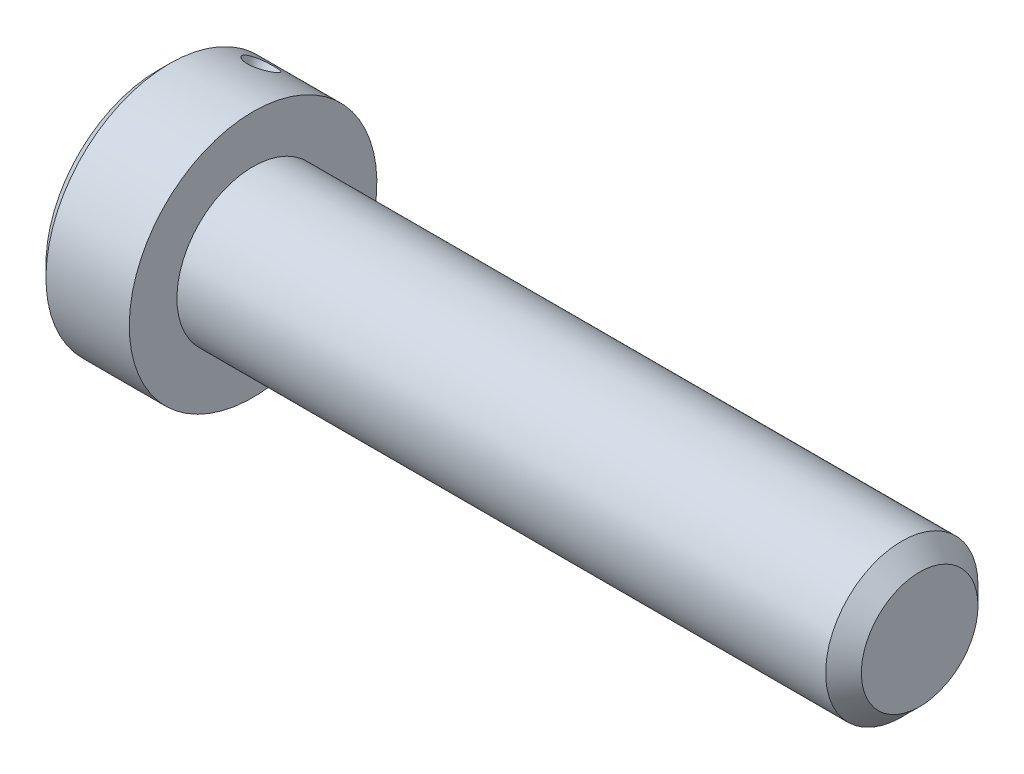
ISO-10303-21;
HEADER;
FILE_DESCRIPTION(('STEP AP214'),'2;1');
FILE_NAME('part.step','',(''),(''),'','','');
FILE_SCHEMA(('AUTOMOTIVE_DESIGN { 1 0 10303 214 1 1 1 1 }'));
ENDSEC;
DATA;
#1=APPLICATION_CONTEXT('core data for automotive mechanical design processes');
#2=APPLICATION_PROTOCOL_DEFINITION('international standard','automotive_design',2000,#1);
#3=PRODUCT_CONTEXT('',#1,'mechanical');
#4=PRODUCT('Part','Part','',(#3));
#5=PRODUCT_RELATED_PRODUCT_CATEGORY('part','',(#4));
#6=PRODUCT_DEFINITION_FORMATION('','',#4);
#7=PRODUCT_DEFINITION_CONTEXT('part definition',#1,'design');
#8=PRODUCT_DEFINITION('design','',#6,#7);
#9=PRODUCT_DEFINITION_SHAPE('','',#8);
#10=(LENGTH_UNIT() NAMED_UNIT(*) SI_UNIT(.MILLI.,.METRE.));
#11=(NAMED_UNIT(*) PLANE_ANGLE_UNIT() SI_UNIT($,.RADIAN.));
#12=(NAMED_UNIT(*) SI_UNIT($,.STERADIAN.) SOLID_ANGLE_UNIT());
#13=UNCERTAINTY_MEASURE_WITH_UNIT(LENGTH_MEASURE(1.E-05),#10,'distance_accuracy_value','');
#14=(GEOMETRIC_REPRESENTATION_CONTEXT(3) GLOBAL_UNCERTAINTY_ASSIGNED_CONTEXT((#13)) GLOBAL_UNIT_ASSIGNED_CONTEXT((#10,
#11,#12)) REPRESENTATION_CONTEXT('',''));
#15=CARTESIAN_POINT('',(0.,0.,0.));
#16=DIRECTION('',(0.,0.,1.));
#17=DIRECTION('',(1.,0.,0.));
#18=AXIS2_PLACEMENT_3D('',#15,#16,#17);
#19=CARTESIAN_POINT('',(-22.5,5.87499999999999,0.));
#20=DIRECTION('',(-1.,0.,0.));
#21=DIRECTION('',(0.,-1.,0.));
#22=AXIS2_PLACEMENT_3D('',#19,#20,#21);
#23=PLANE('',#22);
#24=CARTESIAN_POINT('',(-22.5,0.,0.));
#25=DIRECTION('',(-1.,0.,0.));
#26=DIRECTION('',(0.,-1.,0.));
#27=AXIS2_PLACEMENT_3D('',#24,#25,#26);
#28=CIRCLE('',#27,2.88675134594805);
#29=CARTESIAN_POINT('',(-22.5,-2.886751345948,-2.18358317538581E-13));
#30=VERTEX_POINT('',#29);
#31=CARTESIAN_POINT('',(-22.5,-1.44337567297417,2.49999999999982));
#32=VERTEX_POINT('',#31);
#33=EDGE_CURVE('E139',#30,#32,#28,.T.);
#34=ORIENTED_EDGE('',*,*,#33,.F.);
#35=CARTESIAN_POINT('',(-22.5,-1.44337567297406,-2.5));
#36=VERTEX_POINT('',#35);
#37=EDGE_CURVE('E135',#36,#30,#28,.T.);
#38=ORIENTED_EDGE('',*,*,#37,.F.);
#39=CARTESIAN_POINT('',(-22.5,1.44337567297394,-2.5));
#40=VERTEX_POINT('',#39);
#41=EDGE_CURVE('E103',#40,#36,#28,.T.);
#42=ORIENTED_EDGE('',*,*,#41,.F.);
#43=CARTESIAN_POINT('',(-22.5,2.88675134594809,0.));
#44=VERTEX_POINT('',#43);
#45=EDGE_CURVE('E95',#44,#40,#28,.T.);
#46=ORIENTED_EDGE('',*,*,#45,.F.);
#47=CARTESIAN_POINT('',(-22.5,1.44337567297394,2.5));
#48=VERTEX_POINT('',#47);
#49=EDGE_CURVE('E56',#48,#44,#28,.T.);
#50=ORIENTED_EDGE('',*,*,#49,.F.);
#51=EDGE_CURVE('E63',#32,#48,#28,.T.);
#52=ORIENTED_EDGE('',*,*,#51,.F.);
#53=EDGE_LOOP('',(#34,#38,#42,#46,#50,#52));
#54=FACE_BOUND('',#53,.T.);
#55=CARTESIAN_POINT('',(-22.5,0.,0.));
#56=DIRECTION('',(1.,0.,0.));
#57=DIRECTION('',(0.,1.,0.));
#58=AXIS2_PLACEMENT_3D('',#55,#56,#57);
#59=CIRCLE('',#58,5.87499999999999);
#60=CARTESIAN_POINT('',(-22.5,5.87499999999999,0.));
#61=VERTEX_POINT('',#60);
#62=EDGE_CURVE('E269',#61,#61,#59,.T.);
#63=ORIENTED_EDGE('',*,*,#62,.F.);
#64=EDGE_LOOP('',(#63));
#65=FACE_BOUND('',#64,.T.);
#66=ADVANCED_FACE('F40',(#54,#65),#23,.T.);
#67=CARTESIAN_POINT('',(-4.5,0.,0.));
#68=DIRECTION('',(1.,0.,0.));
#69=DIRECTION('',(0.,0.,-1.));
#70=AXIS2_PLACEMENT_3D('',#67,#68,#69);
#71=CYLINDRICAL_SURFACE('',#70,4.);
#72=CARTESIAN_POINT('',(16.5625,0.,0.));
#73=DIRECTION('',(1.,0.,0.));
#74=DIRECTION('',(0.,0.,-1.));
#75=AXIS2_PLACEMENT_3D('',#72,#73,#74);
#76=CIRCLE('',#75,4.);
#77=CARTESIAN_POINT('',(16.5625,0.,-4.));
#78=VERTEX_POINT('',#77);
#79=EDGE_CURVE('E50',#78,#78,#76,.F.);
#80=ORIENTED_EDGE('',*,*,#79,.T.);
#81=EDGE_LOOP('',(#80));
#82=FACE_BOUND('',#81,.T.);
#83=CARTESIAN_POINT('',(-17.5,0.,0.));
#84=DIRECTION('',(-1.,0.,0.));
#85=DIRECTION('',(0.,-1.,0.));
#86=AXIS2_PLACEMENT_3D('',#83,#84,#85);
#87=CIRCLE('',#86,4.);
#88=CARTESIAN_POINT('',(-17.5,-4.00000000000001,0.));
#89=VERTEX_POINT('',#88);
#90=EDGE_CURVE('E281',#89,#89,#87,.T.);
#91=ORIENTED_EDGE('',*,*,#90,.F.);
#92=EDGE_LOOP('',(#91));
#93=FACE_BOUND('',#92,.T.);
#94=ADVANCED_FACE('F221',(#82,#93),#71,.T.);
#95=CARTESIAN_POINT('',(17.5,0.,0.));
#96=DIRECTION('',(1.,0.,0.));
#97=DIRECTION('',(0.,0.,-1.));
#98=AXIS2_PLACEMENT_3D('',#95,#96,#97);
#99=PLANE('',#98);
#100=CARTESIAN_POINT('',(17.5,0.,0.));
#101=DIRECTION('',(1.,0.,0.));
#102=DIRECTION('',(0.,0.,-1.));
#103=AXIS2_PLACEMENT_3D('',#100,#101,#102);
#104=CIRCLE('',#103,3.0625);
#105=CARTESIAN_POINT('',(17.5,0.,-3.0625));
#106=VERTEX_POINT('',#105);
#107=EDGE_CURVE('E285',#106,#106,#104,.T.);
#108=ORIENTED_EDGE('',*,*,#107,.T.);
#109=EDGE_LOOP('',(#108));
#110=FACE_BOUND('',#109,.T.);
#111=ADVANCED_FACE('F229',(#110),#99,.T.);
#112=CARTESIAN_POINT('',(17.5,0.,0.));
#113=DIRECTION('',(-1.,0.,0.));
#114=DIRECTION('',(0.,0.,1.));
#115=AXIS2_PLACEMENT_3D('',#112,#113,#114);
#116=CONICAL_SURFACE('',#115,3.0625,0.785398163397447);
#117=ORIENTED_EDGE('',*,*,#79,.F.);
#118=EDGE_LOOP('',(#117));
#119=FACE_BOUND('',#118,.T.);
#120=ORIENTED_EDGE('',*,*,#107,.F.);
#121=EDGE_LOOP('',(#120));
#122=FACE_BOUND('',#121,.T.);
#123=ADVANCED_FACE('F42',(#119,#122),#116,.T.);
#124=CARTESIAN_POINT('',(-17.5,0.,0.));
#125=DIRECTION('',(1.,0.,0.));
#126=DIRECTION('',(0.,1.,0.));
#127=AXIS2_PLACEMENT_3D('',#124,#125,#126);
#128=CYLINDRICAL_SURFACE('',#127,6.5);
#129=CARTESIAN_POINT('',(-20.331624369458,5.19016094968969,-3.91308437377935));
#130=CARTESIAN_POINT('',(-20.3760309505744,5.1901624373217,-3.91308304695574));
#131=CARTESIAN_POINT('',(-20.4204654898997,5.19243184521226,-3.91007795744997));
#132=CARTESIAN_POINT('',(-20.508098538641,5.20141604940258,-3.89811811837777));
#133=CARTESIAN_POINT('',(-20.5512956975797,5.20813552307258,-3.88915710863354));
#134=CARTESIAN_POINT('',(-20.6351724795781,5.22572052371694,-3.86549620383731));
#135=CARTESIAN_POINT('',(-20.6758537670758,5.23658327475146,-3.85080015103447));
#136=CARTESIAN_POINT('',(-20.7535838806148,5.26199065943321,-3.81600787770095));
#137=CARTESIAN_POINT('',(-20.7906333387501,5.27653465080285,-3.7959125991526));
#138=CARTESIAN_POINT('',(-20.8602539617608,5.30878959712148,-3.75067010843447));
#139=CARTESIAN_POINT('',(-20.8928029010462,5.32651534082248,-3.72549923449517));
#140=CARTESIAN_POINT('',(-20.9523066278094,5.36439114484877,-3.67075106656515));
#141=CARTESIAN_POINT('',(-20.9792611398858,5.38454132444661,-3.64117355576848));
#142=CARTESIAN_POINT('',(-21.026890283206,5.42657799411966,-3.57822386229906));
#143=CARTESIAN_POINT('',(-21.0475448476563,5.44846975805232,-3.54484000998353));
#144=CARTESIAN_POINT('',(-21.081859279883,5.49314948562915,-3.4752004690199));
#145=CARTESIAN_POINT('',(-21.0955193959289,5.51593741743274,-3.43894488235736));
#146=CARTESIAN_POINT('',(-21.1153908965746,5.56152582979656,-3.36471648953024));
#147=CARTESIAN_POINT('',(-21.1216391891081,5.58432567772467,-3.32675317749669));
#148=CARTESIAN_POINT('',(-21.1266240366191,5.62934223790562,-3.24999768276941));
#149=CARTESIAN_POINT('',(-21.1253608743814,5.6515589720794,-3.21120553133391));
#150=CARTESIAN_POINT('',(-21.1153882954136,5.6946674543828,-3.13411919845254));
#151=CARTESIAN_POINT('',(-21.1067185713162,5.71556562889759,-3.09582346522954));
#152=CARTESIAN_POINT('',(-21.0822409912585,5.7556513296971,-3.02064459151104));
#153=CARTESIAN_POINT('',(-21.0664330048555,5.77483882471363,-2.98376147684273));
#154=CARTESIAN_POINT('',(-21.0280852553968,5.81114565403609,-2.91242065043779));
#155=CARTESIAN_POINT('',(-21.0055282661949,5.82825953669852,-2.87796942734975));
#156=CARTESIAN_POINT('',(-20.9543353492905,5.8600617752664,-2.81264959954226));
#157=CARTESIAN_POINT('',(-20.9256991554744,5.87475002494111,-2.78178115174824));
#158=CARTESIAN_POINT('',(-20.862938276506,5.90157890651073,-2.72440418565141));
#159=CARTESIAN_POINT('',(-20.8287790067586,5.91370229444778,-2.69792542211743));
#160=CARTESIAN_POINT('',(-20.7560605768117,5.93513899012913,-2.65043509439742));
#161=CARTESIAN_POINT('',(-20.7175014039302,5.94445228977362,-2.62942354597013));
#162=CARTESIAN_POINT('',(-20.6370476110065,5.96018457305097,-2.59356613101333));
#163=CARTESIAN_POINT('',(-20.5951516839701,5.96660241591896,-2.57872269480544));
#164=CARTESIAN_POINT('',(-20.5092292124843,5.97648736488853,-2.55573019629721));
#165=CARTESIAN_POINT('',(-20.4652027659745,5.97995460649281,-2.54758082658079));
#166=CARTESIAN_POINT('',(-20.3765725072132,5.98390172235961,-2.53829586656304));
#167=CARTESIAN_POINT('',(-20.3319742375466,5.98440068739114,-2.53711545507946));
#168=CARTESIAN_POINT('',(-20.243200270652,5.98245900777121,-2.54169041248143));
#169=CARTESIAN_POINT('',(-20.1990245648563,5.98001842284833,-2.54744564044203));
#170=CARTESIAN_POINT('',(-20.1124941386649,5.97222685418885,-2.5656583919747));
#171=CARTESIAN_POINT('',(-20.0701340321275,5.96688523030946,-2.57809435954308));
#172=CARTESIAN_POINT('',(-19.9882688878975,5.9533371318251,-2.6092266098649));
#173=CARTESIAN_POINT('',(-19.9487639462271,5.94513056092293,-2.62792310304755));
#174=CARTESIAN_POINT('',(-19.8735115217017,5.92587454313237,-2.67106149897394));
#175=CARTESIAN_POINT('',(-19.8377840005232,5.91481096293059,-2.69553191119944));
#176=CARTESIAN_POINT('',(-19.7713041064361,5.88997823796216,-2.74936955013017));
#177=CARTESIAN_POINT('',(-19.7405519181367,5.87620899284402,-2.77873695845595));
#178=CARTESIAN_POINT('',(-19.6847261380487,5.84606444986707,-2.84161048138415));
#179=CARTESIAN_POINT('',(-19.659684295931,5.82967540379011,-2.87513820845476));
#180=CARTESIAN_POINT('',(-19.6162095883016,5.79461700123483,-2.94515612114858));
#181=CARTESIAN_POINT('',(-19.5977765948013,5.77594768892607,-2.98164624938442));
#182=CARTESIAN_POINT('',(-19.5680954323915,5.73675595040756,-3.05637121767761));
#183=CARTESIAN_POINT('',(-19.5568288101894,5.71623844026579,-3.09460130281213));
#184=CARTESIAN_POINT('',(-19.541740151956,5.67379760300243,-3.17174363927725));
#185=CARTESIAN_POINT('',(-19.5379177963016,5.65187433627943,-3.2106558612476));
#186=CARTESIAN_POINT('',(-19.5378319579053,5.60736498347667,-3.28776933423529));
#187=CARTESIAN_POINT('',(-19.5415194773635,5.58478413534111,-3.32597356324909));
#188=CARTESIAN_POINT('',(-19.5562450690948,5.53949963796039,-3.40086154184629));
#189=CARTESIAN_POINT('',(-19.5672831378505,5.51679598877401,-3.43754529215724));
#190=CARTESIAN_POINT('',(-19.5963813322365,5.47200865106763,-3.50840119385756));
#191=CARTESIAN_POINT('',(-19.6144392232091,5.44992476765061,-3.54257414041243));
#192=CARTESIAN_POINT('',(-19.6570593874759,5.4071298057775,-3.60755634724219));
#193=CARTESIAN_POINT('',(-19.6816217237609,5.38641874061861,-3.63836557493777));
#194=CARTESIAN_POINT('',(-19.7367351983841,5.34699763231908,-3.69605826330719));
#195=CARTESIAN_POINT('',(-19.7673228116593,5.32830090633832,-3.72291598112058));
#196=CARTESIAN_POINT('',(-19.8335430948175,5.2937754905521,-3.77184839275756));
#197=CARTESIAN_POINT('',(-19.8691769596741,5.27794748210079,-3.79392195053005));
#198=CARTESIAN_POINT('',(-19.944628343995,5.24975360753921,-3.83284078269263));
#199=CARTESIAN_POINT('',(-19.9844608102512,5.23740072704746,-3.84966647199805));
#200=CARTESIAN_POINT('',(-20.0670497904299,5.21677288398459,-3.87757456996694));
#201=CARTESIAN_POINT('',(-20.1098030508475,5.20849346564159,-3.8886632547625));
#202=CARTESIAN_POINT('',(-20.1825876765843,5.19836438316564,-3.90218543647726));
#203=CARTESIAN_POINT('',(-20.2121590871984,5.19529438264816,-3.90626779000056));
#204=CARTESIAN_POINT('',(-20.2716908777625,5.19119217110177,-3.91171769678254));
#205=CARTESIAN_POINT('',(-20.301651254945,5.19015994558256,-3.91308526934562));
#206=CARTESIAN_POINT('',(-20.331624369458,5.19016094968969,-3.91308437377935));
#207=B_SPLINE_CURVE_WITH_KNOTS('',3,(#129,#130,#131,#132,#133,#134,#135,#136,#137,#138,#139,
#140,#141,#142,#143,#144,#145,#146,#147,#148,#149,#150,#151,#152,#153,#154,#155,#156,#157,#158,
#159,#160,#161,#162,#163,#164,#165,#166,#167,#168,#169,#170,#171,#172,#173,#174,#175,#176,#177,
#178,#179,#180,#181,#182,#183,#184,#185,#186,#187,#188,#189,#190,#191,#192,#193,#194,#195,#196,
#197,#198,#199,#200,#201,#202,#203,#204,#205,#206),.UNSPECIFIED.,.T.,.F.,(4,2,2,2,2,2,2,2,2,2,2,
2,2,2,2,2,2,2,2,2,2,2,2,2,2,2,2,2,2,2,2,2,2,2,2,2,2,2,4),(0.,0.133110251818138,
0.266360635535921,0.399521899671534,0.53265994673786,0.666433645012087,0.800213927109716,
0.934415984491869,1.06861327801291,1.20213947899819,1.33566065313692,1.46847072840503,
1.60128323070904,1.73443765806929,1.8675979153895,2.00162681931007,2.13565610955223,
2.26973815923218,2.40381405102851,2.53702667986932,2.67023660201436,2.80301926953457,
2.93580640060323,3.06926343687285,3.20272542391855,3.33691229083014,3.47109655890629,
3.60493389072326,3.73876547604287,3.87172668161594,4.0046878235645,4.1376066738958,
4.27052681149884,4.40427780267127,4.53806051976529,4.67233670061378,4.80646567458229,
4.89631175349576,4.98615719352502),.UNSPECIFIED.);
#208=CARTESIAN_POINT('',(-20.331624369458,5.19016094968969,-3.91308437377935));
#209=VERTEX_POINT('',#208);
#210=EDGE_CURVE('E138',#209,#209,#207,.T.);
#211=ORIENTED_EDGE('',*,*,#210,.F.);
#212=EDGE_LOOP('',(#211));
#213=FACE_BOUND('',#212,.T.);
#214=CARTESIAN_POINT('',(-20.331624369458,-5.98391094968969,2.53826904527156));
#215=CARTESIAN_POINT('',(-20.2872177883416,-5.98391054444274,2.53827099701048));
#216=CARTESIAN_POINT('',(-20.2427832490164,-5.98244276453538,2.54173890664814));
#217=CARTESIAN_POINT('',(-20.155150200275,-5.97657734216884,2.55549937524585));
#218=CARTESIAN_POINT('',(-20.1119530413363,-5.97217661692178,2.56579911501624));
#219=CARTESIAN_POINT('',(-20.0280762593379,-5.96047817261389,2.59285862469794));
#220=CARTESIAN_POINT('',(-19.9873949718402,-5.95318239306853,2.60961406945024));
#221=CARTESIAN_POINT('',(-19.9096648583012,-5.93575509284717,2.64901364669512));
#222=CARTESIAN_POINT('',(-19.8726154001659,-5.92562406681299,2.67165675196783));
#223=CARTESIAN_POINT('',(-19.8029947771552,-5.90257039367993,2.72221160023653));
#224=CARTESIAN_POINT('',(-19.7704458378698,-5.88963464926354,2.75014798155222));
#225=CARTESIAN_POINT('',(-19.7109421111066,-5.86115924703864,2.81032347399275));
#226=CARTESIAN_POINT('',(-19.6839875990302,-5.84561946110693,2.84256279681363));
#227=CARTESIAN_POINT('',(-19.63635845571,-5.81212176223849,2.9104424673757));
#228=CARTESIAN_POINT('',(-19.6157038912597,-5.79415638002339,2.9460932172328));
#229=CARTESIAN_POINT('',(-19.581389459033,-5.75618663222941,3.01960676683032));
#230=CARTESIAN_POINT('',(-19.5677293429871,-5.73618233905234,3.0574694880032));
#231=CARTESIAN_POINT('',(-19.5478578423415,-5.69469287136387,3.13406440764203));
#232=CARTESIAN_POINT('',(-19.541609549808,-5.67321560269507,3.17279131116697));
#233=CARTESIAN_POINT('',(-19.5366247022969,-5.62925167447169,3.25015454323831));
#234=CARTESIAN_POINT('',(-19.5378878645346,-5.60676505294797,3.28879087513968));
#235=CARTESIAN_POINT('',(-19.5478604435024,-5.56156057153982,3.3646670823737));
#236=CARTESIAN_POINT('',(-19.5565301675999,-5.53884458096955,3.40191329900773));
#237=CARTESIAN_POINT('',(-19.5810077476575,-5.49378061690119,3.47421797108786));
#238=CARTESIAN_POINT('',(-19.5968157340605,-5.471432650136,3.50927638654131));
#239=CARTESIAN_POINT('',(-19.6351634835192,-5.42780309680358,3.5763894362679));
#240=CARTESIAN_POINT('',(-19.6577204727211,-5.4065244037491,3.60843610495497));
#241=CARTESIAN_POINT('',(-19.7089133896255,-5.36585689278093,3.66863756535571));
#242=CARTESIAN_POINT('',(-19.7375495834416,-5.34646815765327,3.69679218660815));
#243=CARTESIAN_POINT('',(-19.8003104624101,-5.31019268820615,3.74871516265097));
#244=CARTESIAN_POINT('',(-19.8344697321574,-5.29332310029344,3.77245370635139));
#245=CARTESIAN_POINT('',(-19.9071881621044,-5.26291361789454,3.81476359324464));
#246=CARTESIAN_POINT('',(-19.9457473349859,-5.24937373300591,3.83333492154346));
#247=CARTESIAN_POINT('',(-20.0262011279095,-5.22618644237795,3.86488818599959));
#248=CARTESIAN_POINT('',(-20.0680970549459,-5.21654057097646,3.8778679190647));
#249=CARTESIAN_POINT('',(-20.1540195264317,-5.20157095765665,3.89792478524158));
#250=CARTESIAN_POINT('',(-20.1980459729415,-5.19624701725954,3.90500218941016));
#251=CARTESIAN_POINT('',(-20.2866762317028,-5.19017956394444,3.91306297203137));
#252=CARTESIAN_POINT('',(-20.3312745013695,-5.1894067801285,3.91408529416605));
#253=CARTESIAN_POINT('',(-20.4200484682641,-5.19239796964987,3.9101162715882));
#254=CARTESIAN_POINT('',(-20.4642241740597,-5.19616185080689,3.9051250490646));
#255=CARTESIAN_POINT('',(-20.5507546002512,-5.20803877197725,3.88927097690382));
#256=CARTESIAN_POINT('',(-20.5931147067885,-5.21613782387242,3.87842701114261));
#257=CARTESIAN_POINT('',(-20.6749798510185,-5.2363250942859,3.85112788852127));
#258=CARTESIAN_POINT('',(-20.7144847926889,-5.24841344689268,3.83467254305071));
#259=CARTESIAN_POINT('',(-20.7897372172144,-5.27614438474816,3.79642714450517));
#260=CARTESIAN_POINT('',(-20.8254647383928,-5.29180459327563,3.77461059688087));
#261=CARTESIAN_POINT('',(-20.89194463248,-5.32601299378521,3.72618600674765));
#262=CARTESIAN_POINT('',(-20.9226968207794,-5.34456129287957,3.69957778652152));
#263=CARTESIAN_POINT('',(-20.9785226008674,-5.38393908947234,3.6420350850539));
#264=CARTESIAN_POINT('',(-21.003564442985,-5.40478042980817,3.61107789127216));
#265=CARTESIAN_POINT('',(-21.0470391506144,-5.44788851964333,3.54570746769628));
#266=CARTESIAN_POINT('',(-21.0654721441147,-5.47015524152854,3.51129430484779));
#267=CARTESIAN_POINT('',(-21.0951533065245,-5.51527309310818,3.43999077952569));
#268=CARTESIAN_POINT('',(-21.1064199287267,-5.53812256295262,3.40310705195325));
#269=CARTESIAN_POINT('',(-21.1215085869601,-5.58370936740702,3.32778104049274));
#270=CARTESIAN_POINT('',(-21.1253309426145,-5.60644670678954,3.28933882359151));
#271=CARTESIAN_POINT('',(-21.1254167810108,-5.65097425696955,3.21223585686446));
#272=CARTESIAN_POINT('',(-21.1217292615525,-5.67276966575972,3.17357815423317));
#273=CARTESIAN_POINT('',(-21.1070036698212,-5.7149823089726,3.09691663980526));
#274=CARTESIAN_POINT('',(-21.0959656010655,-5.73539954405478,3.05891282769576));
#275=CARTESIAN_POINT('',(-21.0668674066796,-5.77436888608212,2.98469790462401));
#276=CARTESIAN_POINT('',(-21.0488095157069,-5.79292158421229,2.94848622729322));
#277=CARTESIAN_POINT('',(-21.0061893514402,-5.82780034518428,2.87893359974224));
#278=CARTESIAN_POINT('',(-20.9816270151551,-5.84412638646019,2.84559267732742));
#279=CARTESIAN_POINT('',(-20.9265135405319,-5.87437916605097,2.78260665190998));
#280=CARTESIAN_POINT('',(-20.8959259272567,-5.88829026897466,2.75298595333634));
#281=CARTESIAN_POINT('',(-20.8297056440985,-5.91340427262761,2.69861986037077));
#282=CARTESIAN_POINT('',(-20.7940717792419,-5.92460653018483,2.67387562407437));
#283=CARTESIAN_POINT('',(-20.7186203949211,-5.94421429024246,2.62999959639164));
#284=CARTESIAN_POINT('',(-20.6787879286648,-5.95260932437126,2.61088884342317));
#285=CARTESIAN_POINT('',(-20.5961989484861,-5.96646452465219,2.579070558321));
#286=CARTESIAN_POINT('',(-20.5534456880685,-5.9719278982082,2.56635602930962));
#287=CARTESIAN_POINT('',(-20.4806610623318,-5.9785739098498,2.55082289571104));
#288=CARTESIAN_POINT('',(-20.4510896517176,-5.98057433144946,2.54612302051162));
#289=CARTESIAN_POINT('',(-20.3915578611535,-5.98324298339772,2.53984544770976));
#290=CARTESIAN_POINT('',(-20.361597483971,-5.98391122321926,2.53826772790615));
#291=CARTESIAN_POINT('',(-20.331624369458,-5.98391094968969,2.53826904527156));
#292=B_SPLINE_CURVE_WITH_KNOTS('',3,(#214,#215,#216,#217,#218,#219,#220,#221,#222,#223,#224,
#225,#226,#227,#228,#229,#230,#231,#232,#233,#234,#235,#236,#237,#238,#239,#240,#241,#242,#243,
#244,#245,#246,#247,#248,#249,#250,#251,#252,#253,#254,#255,#256,#257,#258,#259,#260,#261,#262,
#263,#264,#265,#266,#267,#268,#269,#270,#271,#272,#273,#274,#275,#276,#277,#278,#279,#280,#281,
#282,#283,#284,#285,#286,#287,#288,#289,#290,#291),.UNSPECIFIED.,.T.,.F.,(4,2,2,2,2,2,2,2,2,2,2,
2,2,2,2,2,2,2,2,2,2,2,2,2,2,2,2,2,2,2,2,2,2,2,2,2,2,2,4),(0.,0.133110251818137,
0.266360635535921,0.399521899671534,0.53265994673786,0.66643364501209,0.800213927109716,
0.934415984491869,1.06861327801291,1.20213947899819,1.33566065313692,1.46847072840503,
1.60128323070903,1.73443765806929,1.8675979153895,2.00162681931007,2.13565610955223,
2.26973815923217,2.4038140510285,2.53702667986933,2.67023660201436,2.80301926953458,
2.93580640060323,3.06926343687285,3.20272542391855,3.33691229083014,3.47109655890629,
3.60493389072326,3.73876547604287,3.87172668161594,4.0046878235645,4.1376066738958,
4.27052681149884,4.40427780267127,4.53806051976529,4.67233670061378,4.80646567458229,
4.89631175349576,4.98615719352502),.UNSPECIFIED.);
#293=CARTESIAN_POINT('',(-20.331624369458,-5.98391094968969,2.53826904527156));
#294=VERTEX_POINT('',#293);
#295=EDGE_CURVE('E231',#294,#294,#292,.T.);
#296=ORIENTED_EDGE('',*,*,#295,.F.);
#297=EDGE_LOOP('',(#296));
#298=FACE_BOUND('',#297,.T.);
#299=CARTESIAN_POINT('',(-21.875,0.,0.));
#300=DIRECTION('',(1.,0.,0.));
#301=DIRECTION('',(0.,1.,0.));
#302=AXIS2_PLACEMENT_3D('',#299,#300,#301);
#303=CIRCLE('',#302,6.5);
#304=CARTESIAN_POINT('',(-21.875,6.49999999999999,0.));
#305=VERTEX_POINT('',#304);
#306=EDGE_CURVE('E263',#305,#305,#303,.T.);
#307=ORIENTED_EDGE('',*,*,#306,.T.);
#308=EDGE_LOOP('',(#307));
#309=FACE_BOUND('',#308,.T.);
#310=CARTESIAN_POINT('',(-17.5,0.,0.));
#311=DIRECTION('',(1.,0.,0.));
#312=DIRECTION('',(0.,1.,0.));
#313=AXIS2_PLACEMENT_3D('',#310,#311,#312);
#314=CIRCLE('',#313,6.5);
#315=CARTESIAN_POINT('',(-17.5,6.49999999999999,0.));
#316=VERTEX_POINT('',#315);
#317=EDGE_CURVE('E266',#316,#316,#314,.T.);
#318=ORIENTED_EDGE('',*,*,#317,.F.);
#319=EDGE_LOOP('',(#318));
#320=FACE_BOUND('',#319,.T.);
#321=ADVANCED_FACE('F223',(#213,#298,#309,#320),#128,.T.);
#322=CARTESIAN_POINT('',(-21.875,0.,0.));
#323=DIRECTION('',(1.,0.,0.));
#324=DIRECTION('',(0.,1.,0.));
#325=AXIS2_PLACEMENT_3D('',#322,#323,#324);
#326=CONICAL_SURFACE('',#325,6.5,0.785398163397449);
#327=ORIENTED_EDGE('',*,*,#62,.T.);
#328=EDGE_LOOP('',(#327));
#329=FACE_BOUND('',#328,.T.);
#330=ORIENTED_EDGE('',*,*,#306,.F.);
#331=EDGE_LOOP('',(#330));
#332=FACE_BOUND('',#331,.T.);
#333=ADVANCED_FACE('F217',(#329,#332),#326,.T.);
#334=CARTESIAN_POINT('',(-17.5,6.49999999999999,0.));
#335=DIRECTION('',(1.,0.,0.));
#336=DIRECTION('',(0.,1.,0.));
#337=AXIS2_PLACEMENT_3D('',#334,#335,#336);
#338=PLANE('',#337);
#339=ORIENTED_EDGE('',*,*,#90,.T.);
#340=EDGE_LOOP('',(#339));
#341=FACE_BOUND('',#340,.T.);
#342=ORIENTED_EDGE('',*,*,#317,.T.);
#343=EDGE_LOOP('',(#342));
#344=FACE_BOUND('',#343,.T.);
#345=ADVANCED_FACE('F172',(#341,#344),#338,.T.);
#346=CARTESIAN_POINT('',(-22.5,0.,0.));
#347=DIRECTION('',(-1.,0.,0.));
#348=DIRECTION('',(0.,-1.,0.));
#349=AXIS2_PLACEMENT_3D('',#346,#347,#348);
#350=CONICAL_SURFACE('',#349,2.88675134594805,0.78539816339745);
#351=CARTESIAN_POINT('',(-23.4259641937848,-2.87868021616152,-2.5));
#352=CARTESIAN_POINT('',(-23.3730547693996,-2.80858751756352,-2.5));
#353=CARTESIAN_POINT('',(-23.3206567848066,-2.73810237384455,-2.5));
#354=CARTESIAN_POINT('',(-23.2171126835153,-2.59619238907466,-2.5));
#355=CARTESIAN_POINT('',(-23.165966884378,-2.5247673165714,-2.5));
#356=CARTESIAN_POINT('',(-23.0647924979815,-2.38030019419695,-2.5));
#357=CARTESIAN_POINT('',(-23.0147756377846,-2.30724990359397,-2.5));
#358=CARTESIAN_POINT('',(-22.9166088439156,-2.15990937397291,-2.5));
#359=CARTESIAN_POINT('',(-22.8684587783456,-2.0856192230894,-2.5));
#360=CARTESIAN_POINT('',(-22.7717465594521,-1.93130274871405,-2.5));
#361=CARTESIAN_POINT('',(-22.7233189325374,-1.85119168497847,-2.5));
#362=CARTESIAN_POINT('',(-22.6296640597042,-1.68912282627164,-2.5));
#363=CARTESIAN_POINT('',(-22.5844363916949,-1.60716527674861,-2.5));
#364=CARTESIAN_POINT('',(-22.4981353746694,-1.44137668632316,-2.5));
#365=CARTESIAN_POINT('',(-22.4570503726637,-1.35755175925792,-2.5));
#366=CARTESIAN_POINT('',(-22.3799618661067,-1.18761577759417,-2.5));
#367=CARTESIAN_POINT('',(-22.3439560607347,-1.10150577924726,-2.5));
#368=CARTESIAN_POINT('',(-22.2809497442852,-0.933895283730341,-2.5));
#369=CARTESIAN_POINT('',(-22.2534577201432,-0.852581486652378,-2.5));
#370=CARTESIAN_POINT('',(-22.2049971144175,-0.68799618505139,-2.5));
#371=CARTESIAN_POINT('',(-22.1840289822391,-0.604724546085127,-2.5));
#372=CARTESIAN_POINT('',(-22.1500599950131,-0.438105786501612,-2.5));
#373=CARTESIAN_POINT('',(-22.1369226334437,-0.354786957377844,-2.5));
#374=CARTESIAN_POINT('',(-22.1188701943997,-0.187258638268733,-2.5));
#375=CARTESIAN_POINT('',(-22.1139537035303,-0.103049303891694,-2.5));
#376=CARTESIAN_POINT('',(-22.112708074372,0.0623819458555894,-2.5));
#377=CARTESIAN_POINT('',(-22.116074551711,0.143601667742535,-2.5));
#378=CARTESIAN_POINT('',(-22.130537592381,0.305344840534005,-2.5));
#379=CARTESIAN_POINT('',(-22.1416349066532,0.385868223029699,-2.5));
#380=CARTESIAN_POINT('',(-22.1711420785854,0.546999992477772,-2.5));
#381=CARTESIAN_POINT('',(-22.189676376831,0.627585258156421,-2.5));
#382=CARTESIAN_POINT('',(-22.2330723320142,0.786991930978629,-2.5));
#383=CARTESIAN_POINT('',(-22.2579334595175,0.865813485110866,-2.5));
#384=CARTESIAN_POINT('',(-22.3455589112399,1.11399280220495,-2.5));
#385=CARTESIAN_POINT('',(-22.4183033354747,1.2798402752946,-2.5));
#386=CARTESIAN_POINT('',(-22.5395423452679,1.52253018655043,-2.5));
#387=CARTESIAN_POINT('',(-22.5820714512073,1.60256472908883,-2.5));
#388=CARTESIAN_POINT('',(-22.6703965241523,1.76081489282128,-2.5));
#389=CARTESIAN_POINT('',(-22.7161919024768,1.83903083842891,-2.5));
#390=CARTESIAN_POINT('',(-22.8080446787287,1.99000684607172,-2.5));
#391=CARTESIAN_POINT('',(-22.8539756354245,2.06284472030448,-2.5));
#392=CARTESIAN_POINT('',(-22.9477702453866,2.20727164736139,-2.5));
#393=CARTESIAN_POINT('',(-22.9956340450437,2.27886060500406,-2.5));
#394=CARTESIAN_POINT('',(-23.0925522363184,2.42037078548407,-2.5));
#395=CARTESIAN_POINT('',(-23.1415937983163,2.49030083172882,-2.5));
#396=CARTESIAN_POINT('',(-23.2409738351899,2.62920524991562,-2.5));
#397=CARTESIAN_POINT('',(-23.2913119497075,2.69817987937843,-2.5));
#398=CARTESIAN_POINT('',(-23.3421802976825,2.76675463365827,-2.5));
#399=B_SPLINE_CURVE_WITH_KNOTS('',3,(#351,#352,#353,#354,#355,#356,#357,#358,#359,#360,#361,
#362,#363,#364,#365,#366,#367,#368,#369,#370,#371,#372,#373,#374,#375,#376,#377,#378,#379,#380,
#381,#382,#383,#384,#385,#386,#387,#388,#389,#390,#391,#392,#393,#394,#395,#396,#397,#398),
.UNSPECIFIED.,.F.,.F.,(4,2,2,2,2,2,2,2,2,2,2,2,2,2,2,2,2,2,2,2,2,2,2,4),(0.,0.263465914971116,
0.526997968323241,0.792571943279366,1.05812711983772,1.33890112548019,1.6196380262908,
1.89956181222217,2.17935838571898,2.43663887682601,2.69393708705249,2.94660788173137,
3.19923523085018,3.44271854486788,3.68622551313361,3.93398926860575,4.1817322978197,
4.7233400484191,4.99521600382016,5.26704308216968,5.52534341671995,5.78366335141088,
6.03988492204048,6.29603603207542),.UNSPECIFIED.);
#400=EDGE_CURVE('E11',#36,#40,#399,.T.);
#401=ORIENTED_EDGE('',*,*,#400,.T.);
#402=ORIENTED_EDGE('',*,*,#41,.T.);
#403=EDGE_LOOP('',(#401,#402));
#404=FACE_BOUND('',#403,.T.);
#405=ADVANCED_FACE('F108',(#404),#350,.F.);
#406=CARTESIAN_POINT('',(-22.5001154769819,-2.88686681600197,0.000200000000000396));
#407=CARTESIAN_POINT('',(-22.4505407053549,-2.83725032818751,-0.0857382777877663));
#408=CARTESIAN_POINT('',(-22.4038774813626,-2.78680418128109,-0.173113567275756));
#409=CARTESIAN_POINT('',(-22.3184381400384,-2.6839389026696,-0.351281456165594));
#410=CARTESIAN_POINT('',(-22.2797095624061,-2.6315099876986,-0.442091000681081));
#411=CARTESIAN_POINT('',(-22.2133667038979,-2.52578957716233,-0.625204123126929));
#412=CARTESIAN_POINT('',(-22.185585668531,-2.47252500720903,-0.71746106452935));
#413=CARTESIAN_POINT('',(-22.1427831759108,-2.36482323343209,-0.904006008776298));
#414=CARTESIAN_POINT('',(-22.1277297666715,-2.31038931995912,-0.998288312566297));
#415=CARTESIAN_POINT('',(-22.1141477222096,-2.21657570605386,-1.16077825829186));
#416=CARTESIAN_POINT('',(-22.1121370992409,-2.17731721011877,-1.22877596788017));
#417=CARTESIAN_POINT('',(-22.1155241171876,-2.09886438835669,-1.36466024116924));
#418=CARTESIAN_POINT('',(-22.1209243553,-2.05967008984861,-1.43254675755226));
#419=CARTESIAN_POINT('',(-22.1388257884026,-1.98165157555713,-1.56767878823613));
#420=CARTESIAN_POINT('',(-22.1513349270466,-1.94282782326095,-1.63492349975358));
#421=CARTESIAN_POINT('',(-22.1827675019558,-1.86585167424615,-1.76825010081822));
#422=CARTESIAN_POINT('',(-22.201690446497,-1.82769922629676,-1.83433207909968));
#423=CARTESIAN_POINT('',(-22.2578673614084,-1.72997445583857,-2.00359634669128));
#424=CARTESIAN_POINT('',(-22.2993558315963,-1.6710080703923,-2.10572912222291));
#425=CARTESIAN_POINT('',(-22.3693940467232,-1.58430317001562,-2.25590641494052));
#426=CARTESIAN_POINT('',(-22.3940022521162,-1.55573003305807,-2.30539653988262));
#427=CARTESIAN_POINT('',(-22.4454618867153,-1.49911303110425,-2.40346006383885));
#428=CARTESIAN_POINT('',(-22.4723119387795,-1.47106885396706,-2.45203400349693));
#429=CARTESIAN_POINT('',(-22.5001154769819,-1.44326020292023,-2.5002));
#430=B_SPLINE_CURVE_WITH_KNOTS('',3,(#406,#407,#408,#409,#410,#411,#412,#413,#414,#415,#416,
#417,#418,#419,#420,#421,#422,#423,#424,#425,#426,#427,#428,#429),.UNSPECIFIED.,.F.,.F.,(4,2,2,
2,2,2,2,2,2,2,2,4),(0.,0.33301208513393,0.667964518301407,0.997597032043313,1.32639954393846,
1.56169424147171,1.79707142102085,2.03271213522174,2.26833478775654,2.64260240809534,
2.82922877818864,3.01574133749024),.UNSPECIFIED.);
#431=EDGE_CURVE('E143',#30,#36,#430,.T.);
#432=ORIENTED_EDGE('',*,*,#431,.T.);
#433=ORIENTED_EDGE('',*,*,#37,.T.);
#434=EDGE_LOOP('',(#432,#433));
#435=FACE_BOUND('',#434,.T.);
#436=ADVANCED_FACE('F171',(#435),#350,.F.);
#437=CARTESIAN_POINT('',(-22.5001154769819,-1.44326020292023,2.5002));
#438=CARTESIAN_POINT('',(-22.4505407053548,-1.49287669073468,2.41426172221224));
#439=CARTESIAN_POINT('',(-22.4038774813626,-1.5433228376411,2.32688643272425));
#440=CARTESIAN_POINT('',(-22.3184381400384,-1.64618811625259,2.14871854383442));
#441=CARTESIAN_POINT('',(-22.2797095624061,-1.69861703122359,2.05790899931893));
#442=CARTESIAN_POINT('',(-22.2133667038979,-1.80433744175985,1.87479587687309));
#443=CARTESIAN_POINT('',(-22.185585668531,-1.85760201171315,1.78253893547067));
#444=CARTESIAN_POINT('',(-22.1427831759108,-1.96530378549008,1.59599399122373));
#445=CARTESIAN_POINT('',(-22.1277297666715,-2.01973769896306,1.50171168743373));
#446=CARTESIAN_POINT('',(-22.1141477222096,-2.11355131286832,1.33922174170817));
#447=CARTESIAN_POINT('',(-22.1121370992409,-2.1528098088034,1.27122403211986));
#448=CARTESIAN_POINT('',(-22.1155241171876,-2.23126263056549,1.13533975883079));
#449=CARTESIAN_POINT('',(-22.1209243553,-2.27045692907357,1.06745324244777));
#450=CARTESIAN_POINT('',(-22.1388257884026,-2.34847544336504,0.932321211763906));
#451=CARTESIAN_POINT('',(-22.1513349270466,-2.38729919566122,0.86507650024645));
#452=CARTESIAN_POINT('',(-22.1827675019558,-2.46427534467603,0.731749899181811));
#453=CARTESIAN_POINT('',(-22.201690446497,-2.50242779262541,0.665667920900352));
#454=CARTESIAN_POINT('',(-22.2578673614084,-2.60015256308361,0.496403653308742));
#455=CARTESIAN_POINT('',(-22.2993558315963,-2.65911894852988,0.394270877777112));
#456=CARTESIAN_POINT('',(-22.3693940467232,-2.74582384890657,0.244093585059495));
#457=CARTESIAN_POINT('',(-22.3940022521162,-2.77439698586412,0.194603460117394));
#458=CARTESIAN_POINT('',(-22.4454618867154,-2.83101398781794,0.096539936161156));
#459=CARTESIAN_POINT('',(-22.4723119387795,-2.85905816495513,0.0479659965030741));
#460=CARTESIAN_POINT('',(-22.5001154769819,-2.88686681600197,-0.000199999999999266));
#461=B_SPLINE_CURVE_WITH_KNOTS('',3,(#437,#438,#439,#440,#441,#442,#443,#444,#445,#446,#447,
#448,#449,#450,#451,#452,#453,#454,#455,#456,#457,#458,#459,#460),.UNSPECIFIED.,.F.,.F.,(4,2,2,
2,2,2,2,2,2,2,2,4),(0.,0.333012085133918,0.667964518301386,0.997597032043283,1.32639954393842,
1.56169424147167,1.79707142102081,2.03271213522169,2.26833478775649,2.64260240809532,
2.82922877818863,3.01574133749024),.UNSPECIFIED.);
#462=EDGE_CURVE('E158',#32,#30,#461,.T.);
#463=ORIENTED_EDGE('',*,*,#462,.T.);
#464=ORIENTED_EDGE('',*,*,#33,.T.);
#465=EDGE_LOOP('',(#463,#464));
#466=FACE_BOUND('',#465,.T.);
#467=ADVANCED_FACE('F332',(#466),#350,.F.);
#468=CARTESIAN_POINT('',(-23.4259641937848,-2.87868021616152,2.5));
#469=CARTESIAN_POINT('',(-23.3730547693996,-2.80858751756352,2.5));
#470=CARTESIAN_POINT('',(-23.3206567848066,-2.73810237384455,2.5));
#471=CARTESIAN_POINT('',(-23.2171126835153,-2.59619238907467,2.5));
#472=CARTESIAN_POINT('',(-23.165966884378,-2.5247673165714,2.5));
#473=CARTESIAN_POINT('',(-23.0647924979815,-2.38030019419695,2.5));
#474=CARTESIAN_POINT('',(-23.0147756377846,-2.30724990359397,2.5));
#475=CARTESIAN_POINT('',(-22.9166088439156,-2.15990937397291,2.5));
#476=CARTESIAN_POINT('',(-22.8684587783456,-2.0856192230894,2.5));
#477=CARTESIAN_POINT('',(-22.7717465594521,-1.93130274871405,2.5));
#478=CARTESIAN_POINT('',(-22.7233189325374,-1.85119168497847,2.5));
#479=CARTESIAN_POINT('',(-22.6296640597042,-1.68912282627164,2.5));
#480=CARTESIAN_POINT('',(-22.5844363916949,-1.60716527674861,2.5));
#481=CARTESIAN_POINT('',(-22.4981353746694,-1.44137668632315,2.5));
#482=CARTESIAN_POINT('',(-22.4570503726637,-1.35755175925792,2.5));
#483=CARTESIAN_POINT('',(-22.3799618661067,-1.18761577759417,2.5));
#484=CARTESIAN_POINT('',(-22.3439560607347,-1.10150577924726,2.5));
#485=CARTESIAN_POINT('',(-22.2809497442852,-0.93389528373034,2.5));
#486=CARTESIAN_POINT('',(-22.2534577201432,-0.852581486652378,2.5));
#487=CARTESIAN_POINT('',(-22.2049971144175,-0.687996185051391,2.5));
#488=CARTESIAN_POINT('',(-22.1840289822391,-0.604724546085127,2.5));
#489=CARTESIAN_POINT('',(-22.1500599950131,-0.438105786501613,2.5));
#490=CARTESIAN_POINT('',(-22.1369226334437,-0.354786957377844,2.5));
#491=CARTESIAN_POINT('',(-22.1188701943997,-0.187258638268734,2.5));
#492=CARTESIAN_POINT('',(-22.1139537035303,-0.103049303891695,2.5));
#493=CARTESIAN_POINT('',(-22.112708074372,0.0623819458555882,2.5));
#494=CARTESIAN_POINT('',(-22.116074551711,0.143601667742533,2.5));
#495=CARTESIAN_POINT('',(-22.130537592381,0.305344840534004,2.5));
#496=CARTESIAN_POINT('',(-22.1416349066532,0.385868223029698,2.5));
#497=CARTESIAN_POINT('',(-22.1711420785854,0.546999992477771,2.5));
#498=CARTESIAN_POINT('',(-22.189676376831,0.62758525815642,2.5));
#499=CARTESIAN_POINT('',(-22.2330723320142,0.786991930978628,2.5));
#500=CARTESIAN_POINT('',(-22.2579334595175,0.865813485110865,2.5));
#501=CARTESIAN_POINT('',(-22.3455589112399,1.11399280220495,2.5));
#502=CARTESIAN_POINT('',(-22.4183033354747,1.2798402752946,2.5));
#503=CARTESIAN_POINT('',(-22.5395423452679,1.52253018655042,2.5));
#504=CARTESIAN_POINT('',(-22.5820714512073,1.60256472908883,2.5));
#505=CARTESIAN_POINT('',(-22.6703965241523,1.76081489282128,2.5));
#506=CARTESIAN_POINT('',(-22.7161919024768,1.8390308384289,2.5));
#507=CARTESIAN_POINT('',(-22.8080446787287,1.99000684607171,2.5));
#508=CARTESIAN_POINT('',(-22.8539756354245,2.06284472030448,2.5));
#509=CARTESIAN_POINT('',(-22.9477702453866,2.20727164736139,2.5));
#510=CARTESIAN_POINT('',(-22.9956340450437,2.27886060500406,2.5));
#511=CARTESIAN_POINT('',(-23.0925522363184,2.42037078548406,2.5));
#512=CARTESIAN_POINT('',(-23.1415937983163,2.49030083172882,2.5));
#513=CARTESIAN_POINT('',(-23.2409738351899,2.62920524991562,2.5));
#514=CARTESIAN_POINT('',(-23.2913119497075,2.69817987937843,2.5));
#515=CARTESIAN_POINT('',(-23.3421802976825,2.76675463365827,2.5));
#516=B_SPLINE_CURVE_WITH_KNOTS('',3,(#468,#469,#470,#471,#472,#473,#474,#475,#476,#477,#478,
#479,#480,#481,#482,#483,#484,#485,#486,#487,#488,#489,#490,#491,#492,#493,#494,#495,#496,#497,
#498,#499,#500,#501,#502,#503,#504,#505,#506,#507,#508,#509,#510,#511,#512,#513,#514,#515),
.UNSPECIFIED.,.F.,.F.,(4,2,2,2,2,2,2,2,2,2,2,2,2,2,2,2,2,2,2,2,2,2,2,4),(0.,0.263465914971117,
0.526997968323243,0.792571943279369,1.05812711983772,1.3389011254802,1.6196380262908,
1.89956181222218,2.17935838571899,2.43663887682602,2.69393708705249,2.94660788173137,
3.19923523085018,3.44271854486788,3.68622551313362,3.93398926860575,4.1817322978197,
4.7233400484191,4.99521600382016,5.26704308216968,5.52534341671995,5.78366335141087,
6.03988492204048,6.29603603207542),.UNSPECIFIED.);
#517=EDGE_CURVE('E186',#48,#32,#516,.F.);
#518=ORIENTED_EDGE('',*,*,#517,.T.);
#519=ORIENTED_EDGE('',*,*,#51,.T.);
#520=EDGE_LOOP('',(#518,#519));
#521=FACE_BOUND('',#520,.T.);
#522=ADVANCED_FACE('F341',(#521),#350,.F.);
#523=CARTESIAN_POINT('',(-22.5001154769818,2.88686681600197,-0.000199999999999272));
#524=CARTESIAN_POINT('',(-22.4505407053548,2.83725032818751,0.0857382777877651));
#525=CARTESIAN_POINT('',(-22.4038774813625,2.7868041812811,0.173113567275753));
#526=CARTESIAN_POINT('',(-22.3184381400383,2.6839389026696,0.351281456165586));
#527=CARTESIAN_POINT('',(-22.279709562406,2.6315099876986,0.44209100068107));
#528=CARTESIAN_POINT('',(-22.2133667038978,2.52578957716234,0.625204123126914));
#529=CARTESIAN_POINT('',(-22.1855856685309,2.47252500720904,0.717461064529332));
#530=CARTESIAN_POINT('',(-22.1427831759107,2.36482323343211,0.904006008776275));
#531=CARTESIAN_POINT('',(-22.1277297666714,2.31038931995913,0.998288312566271));
#532=CARTESIAN_POINT('',(-22.1141477222095,2.21657570605388,1.16077825829183));
#533=CARTESIAN_POINT('',(-22.1121370992408,2.17731721011879,1.22877596788013));
#534=CARTESIAN_POINT('',(-22.1155241171875,2.09886438835671,1.3646602411692));
#535=CARTESIAN_POINT('',(-22.1209243552999,2.05967008984863,1.43254675755222));
#536=CARTESIAN_POINT('',(-22.1388257884025,1.98165157555716,1.56767878823609));
#537=CARTESIAN_POINT('',(-22.1513349270465,1.94282782326098,1.63492349975354));
#538=CARTESIAN_POINT('',(-22.1827675019558,1.86585167424617,1.76825010081818));
#539=CARTESIAN_POINT('',(-22.2016904464969,1.82769922629679,1.83433207909963));
#540=CARTESIAN_POINT('',(-22.2578673614083,1.72997445583859,2.00359634669124));
#541=CARTESIAN_POINT('',(-22.2993558315962,1.67100807039232,2.10572912222288));
#542=CARTESIAN_POINT('',(-22.3693940467231,1.58430317001563,2.2559064149405));
#543=CARTESIAN_POINT('',(-22.3940022521161,1.55573003305808,2.3053965398826));
#544=CARTESIAN_POINT('',(-22.4454618867153,1.49911303110426,2.40346006383884));
#545=CARTESIAN_POINT('',(-22.4723119387794,1.47106885396706,2.45203400349693));
#546=CARTESIAN_POINT('',(-22.5001154769818,1.44326020292023,2.5002));
#547=B_SPLINE_CURVE_WITH_KNOTS('',3,(#523,#524,#525,#526,#527,#528,#529,#530,#531,#532,#533,
#534,#535,#536,#537,#538,#539,#540,#541,#542,#543,#544,#545,#546),.UNSPECIFIED.,.F.,.F.,(4,2,2,
2,2,2,2,2,2,2,2,4),(0.,0.333012085133919,0.667964518301388,0.997597032043285,1.32639954393842,
1.56169424147166,1.7970714210208,2.03271213522168,2.26833478775647,2.64260240809532,
2.82922877818863,3.01574133749025),.UNSPECIFIED.);
#548=EDGE_CURVE('E124',#44,#48,#547,.T.);
#549=ORIENTED_EDGE('',*,*,#548,.T.);
#550=ORIENTED_EDGE('',*,*,#49,.T.);
#551=EDGE_LOOP('',(#549,#550));
#552=FACE_BOUND('',#551,.T.);
#553=ADVANCED_FACE('F350',(#552),#350,.F.);
#554=CARTESIAN_POINT('',(-22.5001154769818,1.44326020292023,-2.5002));
#555=CARTESIAN_POINT('',(-22.4505407053548,1.49287669073469,-2.41426172221224));
#556=CARTESIAN_POINT('',(-22.4038774813626,1.5433228376411,-2.32688643272425));
#557=CARTESIAN_POINT('',(-22.3184381400384,1.64618811625259,-2.14871854383441));
#558=CARTESIAN_POINT('',(-22.2797095624061,1.6986170312236,-2.05790899931892));
#559=CARTESIAN_POINT('',(-22.2133667038978,1.80433744175986,-1.87479587687307));
#560=CARTESIAN_POINT('',(-22.1855856685309,1.85760201171316,-1.78253893547065));
#561=CARTESIAN_POINT('',(-22.1427831759107,1.9653037854901,-1.5959939912237));
#562=CARTESIAN_POINT('',(-22.1277297666714,2.01973769896307,-1.5017116874337));
#563=CARTESIAN_POINT('',(-22.1141477222095,2.11355131286834,-1.33922174170814));
#564=CARTESIAN_POINT('',(-22.1121370992408,2.15280980880342,-1.27122403211983));
#565=CARTESIAN_POINT('',(-22.1155241171875,2.2312626305655,-1.13533975883077));
#566=CARTESIAN_POINT('',(-22.1209243552999,2.27045692907358,-1.06745324244775));
#567=CARTESIAN_POINT('',(-22.1388257884025,2.34847544336505,-0.932321211763882));
#568=CARTESIAN_POINT('',(-22.1513349270465,2.38729919566123,-0.865076500246428));
#569=CARTESIAN_POINT('',(-22.1827675019558,2.46427534467604,-0.731749899181791));
#570=CARTESIAN_POINT('',(-22.2016904464969,2.50242779262542,-0.665667920900334));
#571=CARTESIAN_POINT('',(-22.2578673614083,2.60015256308362,-0.496403653308729));
#572=CARTESIAN_POINT('',(-22.2993558315962,2.65911894852989,-0.394270877777102));
#573=CARTESIAN_POINT('',(-22.3693940467231,2.74582384890657,-0.244093585059489));
#574=CARTESIAN_POINT('',(-22.3940022521161,2.77439698586412,-0.194603460117389));
#575=CARTESIAN_POINT('',(-22.4454618867153,2.83101398781794,-0.0965399361611533));
#576=CARTESIAN_POINT('',(-22.4723119387794,2.85905816495513,-0.0479659965030724));
#577=CARTESIAN_POINT('',(-22.5001154769818,2.88686681600197,0.000199999999999518));
#578=B_SPLINE_CURVE_WITH_KNOTS('',3,(#554,#555,#556,#557,#558,#559,#560,#561,#562,#563,#564,
#565,#566,#567,#568,#569,#570,#571,#572,#573,#574,#575,#576,#577),.UNSPECIFIED.,.F.,.F.,(4,2,2,
2,2,2,2,2,2,2,2,4),(0.,0.333012085133929,0.667964518301408,0.997597032043317,1.32639954393847,
1.56169424147171,1.79707142102085,2.03271213522172,2.26833478775652,2.64260240809534,
2.82922877818864,3.01574133749025),.UNSPECIFIED.);
#579=EDGE_CURVE('E98',#40,#44,#578,.T.);
#580=ORIENTED_EDGE('',*,*,#579,.T.);
#581=ORIENTED_EDGE('',*,*,#45,.T.);
#582=EDGE_LOOP('',(#580,#581));
#583=FACE_BOUND('',#582,.T.);
#584=ADVANCED_FACE('F96',(#583),#350,.F.);
#585=CARTESIAN_POINT('',(-18.55,2.88675134594813,0.));
#586=DIRECTION('',(1.,0.,0.));
#587=DIRECTION('',(0.,0.,-1.));
#588=AXIS2_PLACEMENT_3D('',#585,#586,#587);
#589=PLANE('',#588);
#590=DIRECTION('',(0.,0.5,0.866025403784439));
#591=VECTOR('',#590,1.);
#592=CARTESIAN_POINT('',(-18.55,1.44337567297406,-2.5));
#593=LINE('',#592,#591);
#594=CARTESIAN_POINT('',(-18.55,1.44337567297406,-2.5));
#595=VERTEX_POINT('',#594);
#596=CARTESIAN_POINT('',(-18.55,2.88675134594813,0.));
#597=VERTEX_POINT('',#596);
#598=EDGE_CURVE('E123',#595,#597,#593,.T.);
#599=ORIENTED_EDGE('',*,*,#598,.F.);
#600=DIRECTION('',(0.,1.,0.));
#601=VECTOR('',#600,1.);
#602=CARTESIAN_POINT('',(-18.55,-1.44337567297406,-2.5));
#603=LINE('',#602,#601);
#604=CARTESIAN_POINT('',(-18.55,-1.44337567297406,-2.5));
#605=VERTEX_POINT('',#604);
#606=EDGE_CURVE('E128',#605,#595,#603,.T.);
#607=ORIENTED_EDGE('',*,*,#606,.F.);
#608=DIRECTION('',(0.,0.5,-0.866025403784439));
#609=VECTOR('',#608,1.);
#610=CARTESIAN_POINT('',(-18.55,-2.88675134594813,0.));
#611=LINE('',#610,#609);
#612=CARTESIAN_POINT('',(-18.55,-2.88675134594813,0.));
#613=VERTEX_POINT('',#612);
#614=EDGE_CURVE('E463',#613,#605,#611,.T.);
#615=ORIENTED_EDGE('',*,*,#614,.F.);
#616=DIRECTION('',(0.,-0.5,-0.866025403784439));
#617=VECTOR('',#616,1.);
#618=CARTESIAN_POINT('',(-18.55,-1.44337567297406,2.5));
#619=LINE('',#618,#617);
#620=CARTESIAN_POINT('',(-18.55,-1.44337567297406,2.5));
#621=VERTEX_POINT('',#620);
#622=EDGE_CURVE('E460',#621,#613,#619,.T.);
#623=ORIENTED_EDGE('',*,*,#622,.F.);
#624=DIRECTION('',(0.,-1.,0.));
#625=VECTOR('',#624,1.);
#626=CARTESIAN_POINT('',(-18.55,1.44337567297406,2.5));
#627=LINE('',#626,#625);
#628=CARTESIAN_POINT('',(-18.55,1.44337567297406,2.5));
#629=VERTEX_POINT('',#628);
#630=EDGE_CURVE('E448',#629,#621,#627,.T.);
#631=ORIENTED_EDGE('',*,*,#630,.F.);
#632=DIRECTION('',(0.,-0.5,0.866025403784439));
#633=VECTOR('',#632,1.);
#634=CARTESIAN_POINT('',(-18.55,2.88675134594813,0.));
#635=LINE('',#634,#633);
#636=EDGE_CURVE('E456',#597,#629,#635,.T.);
#637=ORIENTED_EDGE('',*,*,#636,.F.);
#638=EDGE_LOOP('',(#599,#607,#615,#623,#631,#637));
#639=FACE_BOUND('',#638,.T.);
#640=ADVANCED_FACE('F175',(#639),#589,.F.);
#641=CARTESIAN_POINT('',(-18.55,-1.44337567297406,-2.5));
#642=DIRECTION('',(0.,0.,1.));
#643=DIRECTION('',(1.,0.,0.));
#644=AXIS2_PLACEMENT_3D('',#641,#642,#643);
#645=PLANE('',#644);
#646=ORIENTED_EDGE('',*,*,#400,.F.);
#647=DIRECTION('',(-1.,0.,0.));
#648=VECTOR('',#647,1.);
#649=CARTESIAN_POINT('',(-18.55,-1.44337567297406,-2.5));
#650=LINE('',#649,#648);
#651=EDGE_CURVE('E130',#605,#36,#650,.T.);
#652=ORIENTED_EDGE('',*,*,#651,.F.);
#653=ORIENTED_EDGE('',*,*,#606,.T.);
#654=DIRECTION('',(-1.,0.,0.));
#655=VECTOR('',#654,1.);
#656=CARTESIAN_POINT('',(-18.55,1.44337567297406,-2.5));
#657=LINE('',#656,#655);
#658=EDGE_CURVE('E118',#595,#40,#657,.T.);
#659=ORIENTED_EDGE('',*,*,#658,.T.);
#660=EDGE_LOOP('',(#646,#652,#653,#659));
#661=FACE_BOUND('',#660,.T.);
#662=ADVANCED_FACE('F126',(#661),#645,.T.);
#663=CARTESIAN_POINT('',(-18.55,-2.88675134594813,0.));
#664=DIRECTION('',(0.,0.866025403784439,0.5));
#665=DIRECTION('',(0.,-0.5,0.866025403784439));
#666=AXIS2_PLACEMENT_3D('',#663,#664,#665);
#667=PLANE('',#666);
#668=ORIENTED_EDGE('',*,*,#431,.F.);
#669=DIRECTION('',(-1.,0.,0.));
#670=VECTOR('',#669,1.);
#671=CARTESIAN_POINT('',(-18.55,-2.88675134594813,0.));
#672=LINE('',#671,#670);
#673=EDGE_CURVE('E441',#613,#30,#672,.T.);
#674=ORIENTED_EDGE('',*,*,#673,.F.);
#675=ORIENTED_EDGE('',*,*,#614,.T.);
#676=ORIENTED_EDGE('',*,*,#651,.T.);
#677=EDGE_LOOP('',(#668,#674,#675,#676));
#678=FACE_BOUND('',#677,.T.);
#679=ADVANCED_FACE('F165',(#678),#667,.T.);
#680=CARTESIAN_POINT('',(-18.55,-1.44337567297406,2.5));
#681=DIRECTION('',(0.,0.866025403784439,-0.5));
#682=DIRECTION('',(0.,0.5,0.866025403784439));
#683=AXIS2_PLACEMENT_3D('',#680,#681,#682);
#684=PLANE('',#683);
#685=CARTESIAN_POINT('',(-20.331624369458,-2.1650635094611,1.25));
#686=DIRECTION('',(0.,0.866025403784439,-0.5));
#687=DIRECTION('',(0.,0.5,0.866025403784439));
#688=AXIS2_PLACEMENT_3D('',#685,#686,#687);
#689=CIRCLE('',#688,0.793749999999999);
#690=CARTESIAN_POINT('',(-20.331624369458,-1.7681885094611,1.9374076642539));
#691=VERTEX_POINT('',#690);
#692=EDGE_CURVE('E238',#691,#691,#689,.T.);
#693=ORIENTED_EDGE('',*,*,#692,.F.);
#694=EDGE_LOOP('',(#693));
#695=FACE_BOUND('',#694,.T.);
#696=ORIENTED_EDGE('',*,*,#462,.F.);
#697=DIRECTION('',(-1.,0.,0.));
#698=VECTOR('',#697,1.);
#699=CARTESIAN_POINT('',(-18.55,-1.44337567297406,2.5));
#700=LINE('',#699,#698);
#701=EDGE_CURVE('E438',#621,#32,#700,.T.);
#702=ORIENTED_EDGE('',*,*,#701,.F.);
#703=ORIENTED_EDGE('',*,*,#622,.T.);
#704=ORIENTED_EDGE('',*,*,#673,.T.);
#705=EDGE_LOOP('',(#696,#702,#703,#704));
#706=FACE_BOUND('',#705,.T.);
#707=ADVANCED_FACE('F380',(#695,#706),#684,.T.);
#708=CARTESIAN_POINT('',(-18.55,1.44337567297406,2.5));
#709=DIRECTION('',(0.,0.,-1.));
#710=DIRECTION('',(-1.,0.,0.));
#711=AXIS2_PLACEMENT_3D('',#708,#709,#710);
#712=PLANE('',#711);
#713=ORIENTED_EDGE('',*,*,#517,.F.);
#714=DIRECTION('',(-1.,0.,0.));
#715=VECTOR('',#714,1.);
#716=CARTESIAN_POINT('',(-18.55,1.44337567297406,2.5));
#717=LINE('',#716,#715);
#718=EDGE_CURVE('E275',#629,#48,#717,.T.);
#719=ORIENTED_EDGE('',*,*,#718,.F.);
#720=ORIENTED_EDGE('',*,*,#630,.T.);
#721=ORIENTED_EDGE('',*,*,#701,.T.);
#722=EDGE_LOOP('',(#713,#719,#720,#721));
#723=FACE_BOUND('',#722,.T.);
#724=ADVANCED_FACE('F208',(#723),#712,.T.);
#725=CARTESIAN_POINT('',(-18.55,2.88675134594813,0.));
#726=DIRECTION('',(0.,-0.866025403784439,-0.5));
#727=DIRECTION('',(0.,0.5,-0.866025403784439));
#728=AXIS2_PLACEMENT_3D('',#725,#726,#727);
#729=PLANE('',#728);
#730=ORIENTED_EDGE('',*,*,#548,.F.);
#731=DIRECTION('',(-1.,0.,0.));
#732=VECTOR('',#731,1.);
#733=CARTESIAN_POINT('',(-18.55,2.88675134594813,0.));
#734=LINE('',#733,#732);
#735=EDGE_CURVE('E121',#597,#44,#734,.T.);
#736=ORIENTED_EDGE('',*,*,#735,.F.);
#737=ORIENTED_EDGE('',*,*,#636,.T.);
#738=ORIENTED_EDGE('',*,*,#718,.T.);
#739=EDGE_LOOP('',(#730,#736,#737,#738));
#740=FACE_BOUND('',#739,.T.);
#741=ADVANCED_FACE('F205',(#740),#729,.T.);
#742=CARTESIAN_POINT('',(-18.55,1.44337567297406,-2.5));
#743=DIRECTION('',(0.,-0.866025403784439,0.5));
#744=DIRECTION('',(0.,-0.5,-0.866025403784439));
#745=AXIS2_PLACEMENT_3D('',#742,#743,#744);
#746=PLANE('',#745);
#747=CARTESIAN_POINT('',(-20.331624369458,2.1650635094611,-1.25));
#748=DIRECTION('',(0.,-0.866025403784439,0.5));
#749=DIRECTION('',(0.,-0.5,-0.866025403784439));
#750=AXIS2_PLACEMENT_3D('',#747,#748,#749);
#751=CIRCLE('',#750,0.793749999999999);
#752=CARTESIAN_POINT('',(-20.331624369458,1.7681885094611,-1.9374076642539));
#753=VERTEX_POINT('',#752);
#754=EDGE_CURVE('E44',#753,#753,#751,.T.);
#755=ORIENTED_EDGE('',*,*,#754,.F.);
#756=EDGE_LOOP('',(#755));
#757=FACE_BOUND('',#756,.T.);
#758=ORIENTED_EDGE('',*,*,#579,.F.);
#759=ORIENTED_EDGE('',*,*,#658,.F.);
#760=ORIENTED_EDGE('',*,*,#598,.T.);
#761=ORIENTED_EDGE('',*,*,#735,.T.);
#762=EDGE_LOOP('',(#758,#759,#760,#761));
#763=FACE_BOUND('',#762,.T.);
#764=ADVANCED_FACE('F116',(#757,#763),#746,.T.);
#765=CARTESIAN_POINT('',(-20.331624369458,7.68958256229942,-4.43958256229942));
#766=DIRECTION('',(0.,-0.866025403784439,0.5));
#767=DIRECTION('',(0.,-0.5,-0.866025403784439));
#768=AXIS2_PLACEMENT_3D('',#765,#766,#767);
#769=CYLINDRICAL_SURFACE('',#768,0.793749999999999);
#770=ORIENTED_EDGE('',*,*,#210,.T.);
#771=EDGE_LOOP('',(#770));
#772=FACE_BOUND('',#771,.T.);
#773=ORIENTED_EDGE('',*,*,#754,.T.);
#774=EDGE_LOOP('',(#773));
#775=FACE_BOUND('',#774,.T.);
#776=ADVANCED_FACE('F173',(#772,#775),#769,.F.);
#777=ORIENTED_EDGE('',*,*,#295,.T.);
#778=EDGE_LOOP('',(#777));
#779=FACE_BOUND('',#778,.T.);
#780=ORIENTED_EDGE('',*,*,#692,.T.);
#781=EDGE_LOOP('',(#780));
#782=FACE_BOUND('',#781,.T.);
#783=ADVANCED_FACE('F248',(#779,#782),#769,.F.);
#784=CLOSED_SHELL('',(#66,#94,#111,#123,#321,#333,#345,#405,#436,#467,#522,#553,#584,#640,#662,
#679,#707,#724,#741,#764,#776,#783));
#785=MANIFOLD_SOLID_BREP('B2',#784);
#786=ADVANCED_BREP_SHAPE_REPRESENTATION('',(#18,#785),#14);
#787=SHAPE_DEFINITION_REPRESENTATION(#9,#786);
ENDSEC;
END-ISO-10303-21;
